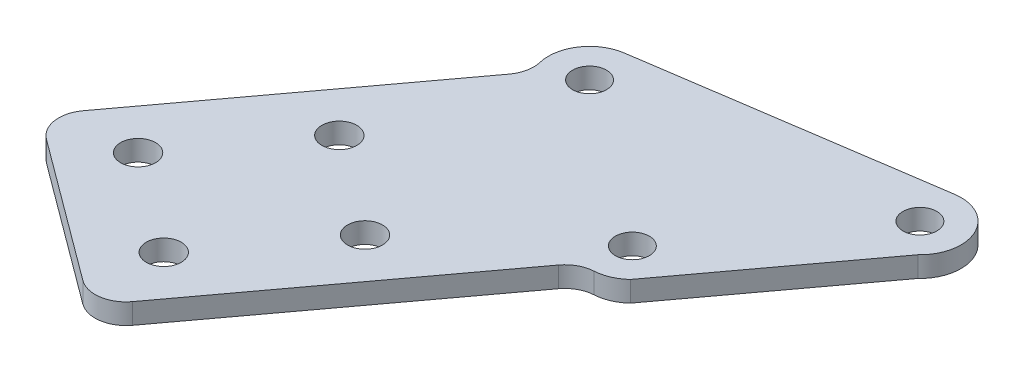
ISO-10303-21;
HEADER;
FILE_DESCRIPTION(('STEP AP214'),'2;1');
FILE_NAME('part.step','',(''),(''),'','','');
FILE_SCHEMA(('AUTOMOTIVE_DESIGN { 1 0 10303 214 1 1 1 1 }'));
ENDSEC;
DATA;
#1=APPLICATION_CONTEXT('core data for automotive mechanical design processes');
#2=APPLICATION_PROTOCOL_DEFINITION('international standard','automotive_design',2000,#1);
#3=PRODUCT_CONTEXT('',#1,'mechanical');
#4=PRODUCT('Part','Part','',(#3));
#5=PRODUCT_RELATED_PRODUCT_CATEGORY('part','',(#4));
#6=PRODUCT_DEFINITION_FORMATION('','',#4);
#7=PRODUCT_DEFINITION_CONTEXT('part definition',#1,'design');
#8=PRODUCT_DEFINITION('design','',#6,#7);
#9=PRODUCT_DEFINITION_SHAPE('','',#8);
#10=(LENGTH_UNIT() NAMED_UNIT(*) SI_UNIT(.MILLI.,.METRE.));
#11=(NAMED_UNIT(*) PLANE_ANGLE_UNIT() SI_UNIT($,.RADIAN.));
#12=(NAMED_UNIT(*) SI_UNIT($,.STERADIAN.) SOLID_ANGLE_UNIT());
#13=UNCERTAINTY_MEASURE_WITH_UNIT(LENGTH_MEASURE(1.E-05),#10,'distance_accuracy_value','');
#14=(GEOMETRIC_REPRESENTATION_CONTEXT(3) GLOBAL_UNCERTAINTY_ASSIGNED_CONTEXT((#13)) GLOBAL_UNIT_ASSIGNED_CONTEXT((#10,
#11,#12)) REPRESENTATION_CONTEXT('',''));
#15=CARTESIAN_POINT('',(0.,0.,0.));
#16=DIRECTION('',(0.,0.,1.));
#17=DIRECTION('',(1.,0.,0.));
#18=AXIS2_PLACEMENT_3D('',#15,#16,#17);
#19=CARTESIAN_POINT('',(-18.3951988573142,1.,118.677671571537));
#20=DIRECTION('',(0.,1.,0.));
#21=DIRECTION('',(0.,0.,1.));
#22=AXIS2_PLACEMENT_3D('',#19,#20,#21);
#23=PLANE('',#22);
#24=CARTESIAN_POINT('',(-6.26719335072895,1.,106.505511433226));
#25=DIRECTION('',(0.,1.,0.));
#26=DIRECTION('',(0.,0.,1.));
#27=AXIS2_PLACEMENT_3D('',#24,#25,#26);
#28=CIRCLE('',#27,1.7);
#29=CARTESIAN_POINT('',(-6.26719335072895,1.,108.205511433226));
#30=VERTEX_POINT('',#29);
#31=EDGE_CURVE('E336',#30,#30,#28,.T.);
#32=ORIENTED_EDGE('',*,*,#31,.F.);
#33=EDGE_LOOP('',(#32));
#34=FACE_BOUND('',#33,.T.);
#35=CARTESIAN_POINT('',(-14.6006047163785,1.,117.755144983296));
#36=DIRECTION('',(0.,1.,0.));
#37=DIRECTION('',(0.,0.,1.));
#38=AXIS2_PLACEMENT_3D('',#35,#36,#37);
#39=CIRCLE('',#38,1.7);
#40=CARTESIAN_POINT('',(-14.6006047163785,1.,119.455144983296));
#41=VERTEX_POINT('',#40);
#42=EDGE_CURVE('E345',#41,#41,#39,.T.);
#43=ORIENTED_EDGE('',*,*,#42,.F.);
#44=EDGE_LOOP('',(#43));
#45=FACE_BOUND('',#44,.T.);
#46=CARTESIAN_POINT('',(-4.95806167346095,1.,124.898069010996));
#47=DIRECTION('',(0.,1.,0.));
#48=DIRECTION('',(0.,0.,1.));
#49=AXIS2_PLACEMENT_3D('',#46,#47,#48);
#50=CIRCLE('',#49,1.7);
#51=CARTESIAN_POINT('',(-4.95806167346095,1.,126.598069010996));
#52=VERTEX_POINT('',#51);
#53=EDGE_CURVE('E355',#52,#52,#50,.T.);
#54=ORIENTED_EDGE('',*,*,#53,.F.);
#55=EDGE_LOOP('',(#54));
#56=FACE_BOUND('',#55,.T.);
#57=CARTESIAN_POINT('',(3.37534969218861,1.,113.648435460926));
#58=DIRECTION('',(0.,1.,0.));
#59=DIRECTION('',(0.,0.,1.));
#60=AXIS2_PLACEMENT_3D('',#57,#58,#59);
#61=CIRCLE('',#60,1.7);
#62=CARTESIAN_POINT('',(3.37534969218861,1.,115.348435460926));
#63=VERTEX_POINT('',#62);
#64=EDGE_CURVE('E363',#63,#63,#61,.T.);
#65=ORIENTED_EDGE('',*,*,#64,.F.);
#66=EDGE_LOOP('',(#65));
#67=FACE_BOUND('',#66,.T.);
#68=CARTESIAN_POINT('',(29.2087901697433,1.,85.4946905321915));
#69=DIRECTION('',(0.,1.,0.));
#70=DIRECTION('',(0.,0.,-1.));
#71=AXIS2_PLACEMENT_3D('',#68,#69,#70);
#72=CIRCLE('',#71,1.65000000727633);
#73=CARTESIAN_POINT('',(29.2087901697433,1.,83.8446905249152));
#74=VERTEX_POINT('',#73);
#75=EDGE_CURVE('E375',#74,#74,#72,.T.);
#76=ORIENTED_EDGE('',*,*,#75,.F.);
#77=EDGE_LOOP('',(#76));
#78=FACE_BOUND('',#77,.T.);
#79=CARTESIAN_POINT('',(-18.3951988573142,1.,118.677671571537));
#80=DIRECTION('',(0.,1.,0.));
#81=DIRECTION('',(0.,0.,1.));
#82=AXIS2_PLACEMENT_3D('',#79,#80,#81);
#83=CIRCLE('',#82,3.00000000000001);
#84=CARTESIAN_POINT('',(-20.8058346180431,1.,116.891940564611));
#85=VERTEX_POINT('',#84);
#86=CARTESIAN_POINT('',(-20.180929864239,1.,121.088307332266));
#87=VERTEX_POINT('',#86);
#88=EDGE_CURVE('E200',#85,#87,#83,.T.);
#89=ORIENTED_EDGE('',*,*,#88,.T.);
#90=DIRECTION('',(0.803545253576461,0.,0.595243668974934));
#91=VECTOR('',#90,1.);
#92=CARTESIAN_POINT('',(-6.52066055336954,1.,131.207449704892));
#93=LINE('',#92,#91);
#94=CARTESIAN_POINT('',(-6.52066055336952,1.,131.207449704892));
#95=VERTEX_POINT('',#94);
#96=EDGE_CURVE('E112',#87,#95,#93,.T.);
#97=ORIENTED_EDGE('',*,*,#96,.T.);
#98=CARTESIAN_POINT('',(-4.73492954644467,1.,128.796813944162));
#99=DIRECTION('',(0.,1.,0.));
#100=DIRECTION('',(0.,0.,-1.));
#101=AXIS2_PLACEMENT_3D('',#98,#99,#100);
#102=CIRCLE('',#101,3.00000000000002);
#103=CARTESIAN_POINT('',(-2.32429378571533,1.,130.582544951087));
#104=VERTEX_POINT('',#103);
#105=EDGE_CURVE('E237',#95,#104,#102,.T.);
#106=ORIENTED_EDGE('',*,*,#105,.T.);
#107=DIRECTION('',(0.595243668974969,0.,-0.803545253576435));
#108=VECTOR('',#107,1.);
#109=CARTESIAN_POINT('',(15.3175959976545,1.,106.766992533777));
#110=LINE('',#109,#108);
#111=CARTESIAN_POINT('',(15.3175959976545,1.,106.766992533777));
#112=VERTEX_POINT('',#111);
#113=EDGE_CURVE('E257',#104,#112,#110,.T.);
#114=ORIENTED_EDGE('',*,*,#113,.T.);
#115=CARTESIAN_POINT('',(17.7282317583839,1.,108.552723540702));
#116=DIRECTION('',(0.,-1.,0.));
#117=DIRECTION('',(0.,0.,1.));
#118=AXIS2_PLACEMENT_3D('',#115,#116,#117);
#119=CIRCLE('',#118,3.);
#120=CARTESIAN_POINT('',(17.5463824863155,1.,105.558240139135));
#121=VERTEX_POINT('',#120);
#122=EDGE_CURVE('E253',#112,#121,#119,.T.);
#123=ORIENTED_EDGE('',*,*,#122,.T.);
#124=CARTESIAN_POINT('',(17.3039167902256,1.,101.565595603714));
#125=DIRECTION('',(0.,1.,0.));
#126=DIRECTION('',(0.,0.,-1.));
#127=AXIS2_PLACEMENT_3D('',#124,#125,#126);
#128=CIRCLE('',#127,4.00000000000122);
#129=CARTESIAN_POINT('',(20.028844772003,1.,104.493865996647));
#130=VERTEX_POINT('',#129);
#131=EDGE_CURVE('E256',#121,#130,#128,.T.);
#132=ORIENTED_EDGE('',*,*,#131,.T.);
#133=DIRECTION('',(0.595243668975705,0.,-0.80354525357589));
#134=VECTOR('',#133,1.);
#135=CARTESIAN_POINT('',(20.028844772003,1.,104.493865996647));
#136=LINE('',#135,#134);
#137=CARTESIAN_POINT('',(31.9337181515207,1.,88.4229609251242));
#138=VERTEX_POINT('',#137);
#139=EDGE_CURVE('E261',#130,#138,#136,.T.);
#140=ORIENTED_EDGE('',*,*,#139,.T.);
#141=CARTESIAN_POINT('',(29.2087901697433,1.,85.4946905321915));
#142=DIRECTION('',(0.,1.,0.));
#143=DIRECTION('',(0.,0.,-1.));
#144=AXIS2_PLACEMENT_3D('',#141,#142,#143);
#145=CIRCLE('',#144,4.);
#146=CARTESIAN_POINT('',(28.6196243177309,1.,81.5383180018523));
#147=VERTEX_POINT('',#146);
#148=EDGE_CURVE('E268',#138,#147,#145,.T.);
#149=ORIENTED_EDGE('',*,*,#148,.T.);
#150=DIRECTION('',(-0.989093132584809,0.,0.14729146300302));
#151=VECTOR('',#150,1.);
#152=CARTESIAN_POINT('',(28.6196243177309,1.,81.5383180018523));
#153=LINE('',#152,#151);
#154=CARTESIAN_POINT('',(0.643845866701124,1.,85.7043496938651));
#155=VERTEX_POINT('',#154);
#156=EDGE_CURVE('E143',#147,#155,#153,.T.);
#157=ORIENTED_EDGE('',*,*,#156,.T.);
#158=CARTESIAN_POINT('',(1.23301171871352,1.,89.6607222242043));
#159=DIRECTION('',(0.,1.,0.));
#160=DIRECTION('',(0.,0.,-1.));
#161=AXIS2_PLACEMENT_3D('',#158,#159,#160);
#162=CIRCLE('',#161,4.00000000000001);
#163=CARTESIAN_POINT('',(-2.65704100219803,1.,90.5921135643663));
#164=VERTEX_POINT('',#163);
#165=EDGE_CURVE('E137',#155,#164,#162,.T.);
#166=ORIENTED_EDGE('',*,*,#165,.T.);
#167=CARTESIAN_POINT('',(-5.57458054288167,1.,91.2906570694878));
#168=DIRECTION('',(0.,-1.,0.));
#169=DIRECTION('',(0.,0.,1.));
#170=AXIS2_PLACEMENT_3D('',#167,#168,#169);
#171=CIRCLE('',#170,2.99999999999999);
#172=CARTESIAN_POINT('',(-3.1639447821528,1.,93.0763880764132));
#173=VERTEX_POINT('',#172);
#174=EDGE_CURVE('E141',#164,#173,#171,.T.);
#175=ORIENTED_EDGE('',*,*,#174,.T.);
#176=DIRECTION('',(-0.595243668975159,0.,0.803545253576294));
#177=VECTOR('',#176,1.);
#178=CARTESIAN_POINT('',(-3.1639447821528,1.,93.0763880764132));
#179=LINE('',#178,#177);
#180=EDGE_CURVE('E57',#173,#85,#179,.T.);
#181=ORIENTED_EDGE('',*,*,#180,.T.);
#182=EDGE_LOOP('',(#89,#97,#106,#114,#123,#132,#140,#149,#157,#166,#175,#181));
#183=FACE_BOUND('',#182,.T.);
#184=CARTESIAN_POINT('',(1.23301171871352,1.,89.6607222242043));
#185=DIRECTION('',(0.,1.,0.));
#186=DIRECTION('',(0.,0.,-1.));
#187=AXIS2_PLACEMENT_3D('',#184,#185,#186);
#188=CIRCLE('',#187,1.65000000726581);
#189=CARTESIAN_POINT('',(1.23301171871352,1.,88.0107222169385));
#190=VERTEX_POINT('',#189);
#191=EDGE_CURVE('E170',#190,#190,#188,.T.);
#192=ORIENTED_EDGE('',*,*,#191,.F.);
#193=EDGE_LOOP('',(#192));
#194=FACE_BOUND('',#193,.T.);
#195=CARTESIAN_POINT('',(17.3039167902256,1.,101.565595603714));
#196=DIRECTION('',(0.,1.,0.));
#197=DIRECTION('',(0.,0.,-1.));
#198=AXIS2_PLACEMENT_3D('',#195,#196,#197);
#199=CIRCLE('',#198,1.65000000725752);
#200=CARTESIAN_POINT('',(17.3039167902256,1.,99.9155955964567));
#201=VERTEX_POINT('',#200);
#202=EDGE_CURVE('E367',#201,#201,#199,.T.);
#203=ORIENTED_EDGE('',*,*,#202,.F.);
#204=EDGE_LOOP('',(#203));
#205=FACE_BOUND('',#204,.T.);
#206=ADVANCED_FACE('F39',(#34,#45,#56,#67,#78,#183,#194,#205),#23,.T.);
#207=CARTESIAN_POINT('',(-18.3951988573142,-1.,118.677671571537));
#208=DIRECTION('',(0.,1.,0.));
#209=DIRECTION('',(0.,0.,1.));
#210=AXIS2_PLACEMENT_3D('',#207,#208,#209);
#211=PLANE('',#210);
#212=CARTESIAN_POINT('',(-6.26719335072895,-1.,106.505511433226));
#213=DIRECTION('',(0.,1.,0.));
#214=DIRECTION('',(0.,0.,1.));
#215=AXIS2_PLACEMENT_3D('',#212,#213,#214);
#216=CIRCLE('',#215,1.7);
#217=CARTESIAN_POINT('',(-6.26719335072895,-1.,108.205511433226));
#218=VERTEX_POINT('',#217);
#219=EDGE_CURVE('E334',#218,#218,#216,.T.);
#220=ORIENTED_EDGE('',*,*,#219,.T.);
#221=EDGE_LOOP('',(#220));
#222=FACE_BOUND('',#221,.T.);
#223=CARTESIAN_POINT('',(-14.6006047163785,-1.,117.755144983296));
#224=DIRECTION('',(0.,1.,0.));
#225=DIRECTION('',(0.,0.,1.));
#226=AXIS2_PLACEMENT_3D('',#223,#224,#225);
#227=CIRCLE('',#226,1.7);
#228=CARTESIAN_POINT('',(-14.6006047163785,-1.,119.455144983296));
#229=VERTEX_POINT('',#228);
#230=EDGE_CURVE('E338',#229,#229,#227,.T.);
#231=ORIENTED_EDGE('',*,*,#230,.T.);
#232=EDGE_LOOP('',(#231));
#233=FACE_BOUND('',#232,.T.);
#234=CARTESIAN_POINT('',(-4.95806167346095,-1.,124.898069010996));
#235=DIRECTION('',(0.,1.,0.));
#236=DIRECTION('',(0.,0.,1.));
#237=AXIS2_PLACEMENT_3D('',#234,#235,#236);
#238=CIRCLE('',#237,1.7);
#239=CARTESIAN_POINT('',(-4.95806167346095,-1.,126.598069010996));
#240=VERTEX_POINT('',#239);
#241=EDGE_CURVE('E351',#240,#240,#238,.T.);
#242=ORIENTED_EDGE('',*,*,#241,.T.);
#243=EDGE_LOOP('',(#242));
#244=FACE_BOUND('',#243,.T.);
#245=CARTESIAN_POINT('',(3.37534969218861,-1.,113.648435460926));
#246=DIRECTION('',(0.,1.,0.));
#247=DIRECTION('',(0.,0.,1.));
#248=AXIS2_PLACEMENT_3D('',#245,#246,#247);
#249=CIRCLE('',#248,1.7);
#250=CARTESIAN_POINT('',(3.37534969218861,-1.,115.348435460926));
#251=VERTEX_POINT('',#250);
#252=EDGE_CURVE('E359',#251,#251,#249,.T.);
#253=ORIENTED_EDGE('',*,*,#252,.T.);
#254=EDGE_LOOP('',(#253));
#255=FACE_BOUND('',#254,.T.);
#256=CARTESIAN_POINT('',(-18.3951988573142,-1.,118.677671571537));
#257=DIRECTION('',(0.,1.,0.));
#258=DIRECTION('',(0.,0.,1.));
#259=AXIS2_PLACEMENT_3D('',#256,#257,#258);
#260=CIRCLE('',#259,3.00000000000001);
#261=CARTESIAN_POINT('',(-20.8058346180431,-1.,116.891940564611));
#262=VERTEX_POINT('',#261);
#263=CARTESIAN_POINT('',(-20.180929864239,-1.,121.088307332266));
#264=VERTEX_POINT('',#263);
#265=EDGE_CURVE('E165',#262,#264,#260,.T.);
#266=ORIENTED_EDGE('',*,*,#265,.F.);
#267=DIRECTION('',(-0.595243668975159,0.,0.803545253576294));
#268=VECTOR('',#267,1.);
#269=CARTESIAN_POINT('',(-3.1639447821528,-1.,93.0763880764132));
#270=LINE('',#269,#268);
#271=CARTESIAN_POINT('',(-3.1639447821528,-1.,93.0763880764132));
#272=VERTEX_POINT('',#271);
#273=EDGE_CURVE('E104',#272,#262,#270,.T.);
#274=ORIENTED_EDGE('',*,*,#273,.F.);
#275=CARTESIAN_POINT('',(-5.57458054288167,-1.,91.2906570694878));
#276=DIRECTION('',(0.,-1.,0.));
#277=DIRECTION('',(0.,0.,1.));
#278=AXIS2_PLACEMENT_3D('',#275,#276,#277);
#279=CIRCLE('',#278,2.99999999999999);
#280=CARTESIAN_POINT('',(-2.65704100219803,-1.,90.5921135643663));
#281=VERTEX_POINT('',#280);
#282=EDGE_CURVE('E98',#281,#272,#279,.T.);
#283=ORIENTED_EDGE('',*,*,#282,.F.);
#284=CARTESIAN_POINT('',(1.23301171871352,-1.,89.6607222242043));
#285=DIRECTION('',(0.,1.,0.));
#286=DIRECTION('',(0.,0.,-1.));
#287=AXIS2_PLACEMENT_3D('',#284,#285,#286);
#288=CIRCLE('',#287,4.00000000000001);
#289=CARTESIAN_POINT('',(0.643845866701124,-1.,85.7043496938651));
#290=VERTEX_POINT('',#289);
#291=EDGE_CURVE('E152',#290,#281,#288,.T.);
#292=ORIENTED_EDGE('',*,*,#291,.F.);
#293=DIRECTION('',(-0.989093132584809,0.,0.14729146300302));
#294=VECTOR('',#293,1.);
#295=CARTESIAN_POINT('',(28.6196243177309,-1.,81.5383180018523));
#296=LINE('',#295,#294);
#297=CARTESIAN_POINT('',(28.6196243177309,-1.,81.5383180018523));
#298=VERTEX_POINT('',#297);
#299=EDGE_CURVE('E191',#298,#290,#296,.T.);
#300=ORIENTED_EDGE('',*,*,#299,.F.);
#301=CARTESIAN_POINT('',(29.2087901697433,-1.,85.4946905321915));
#302=DIRECTION('',(0.,1.,0.));
#303=DIRECTION('',(0.,0.,-1.));
#304=AXIS2_PLACEMENT_3D('',#301,#302,#303);
#305=CIRCLE('',#304,4.);
#306=CARTESIAN_POINT('',(31.9337181515207,-1.,88.4229609251242));
#307=VERTEX_POINT('',#306);
#308=EDGE_CURVE('E188',#307,#298,#305,.T.);
#309=ORIENTED_EDGE('',*,*,#308,.F.);
#310=DIRECTION('',(0.595243668975705,0.,-0.80354525357589));
#311=VECTOR('',#310,1.);
#312=CARTESIAN_POINT('',(20.028844772003,-1.,104.493865996647));
#313=LINE('',#312,#311);
#314=CARTESIAN_POINT('',(20.028844772003,-1.,104.493865996647));
#315=VERTEX_POINT('',#314);
#316=EDGE_CURVE('E185',#315,#307,#313,.T.);
#317=ORIENTED_EDGE('',*,*,#316,.F.);
#318=CARTESIAN_POINT('',(17.3039167902256,-1.,101.565595603714));
#319=DIRECTION('',(0.,1.,0.));
#320=DIRECTION('',(0.,0.,-1.));
#321=AXIS2_PLACEMENT_3D('',#318,#319,#320);
#322=CIRCLE('',#321,4.00000000000122);
#323=CARTESIAN_POINT('',(17.5463824863155,-1.,105.558240139135));
#324=VERTEX_POINT('',#323);
#325=EDGE_CURVE('E182',#324,#315,#322,.T.);
#326=ORIENTED_EDGE('',*,*,#325,.F.);
#327=CARTESIAN_POINT('',(17.7282317583839,-1.,108.552723540702));
#328=DIRECTION('',(0.,-1.,0.));
#329=DIRECTION('',(0.,0.,1.));
#330=AXIS2_PLACEMENT_3D('',#327,#328,#329);
#331=CIRCLE('',#330,3.);
#332=CARTESIAN_POINT('',(15.3175959976545,-1.,106.766992533777));
#333=VERTEX_POINT('',#332);
#334=EDGE_CURVE('E179',#333,#324,#331,.T.);
#335=ORIENTED_EDGE('',*,*,#334,.F.);
#336=DIRECTION('',(0.595243668974969,0.,-0.803545253576435));
#337=VECTOR('',#336,1.);
#338=CARTESIAN_POINT('',(15.3175959976545,-1.,106.766992533777));
#339=LINE('',#338,#337);
#340=CARTESIAN_POINT('',(-2.32429378571533,-1.,130.582544951087));
#341=VERTEX_POINT('',#340);
#342=EDGE_CURVE('E176',#341,#333,#339,.T.);
#343=ORIENTED_EDGE('',*,*,#342,.F.);
#344=CARTESIAN_POINT('',(-4.73492954644467,-1.,128.796813944162));
#345=DIRECTION('',(0.,1.,0.));
#346=DIRECTION('',(0.,0.,-1.));
#347=AXIS2_PLACEMENT_3D('',#344,#345,#346);
#348=CIRCLE('',#347,3.00000000000002);
#349=CARTESIAN_POINT('',(-6.52066055336952,-1.,131.207449704892));
#350=VERTEX_POINT('',#349);
#351=EDGE_CURVE('E173',#350,#341,#348,.T.);
#352=ORIENTED_EDGE('',*,*,#351,.F.);
#353=DIRECTION('',(0.803545253576461,0.,0.595243668974934));
#354=VECTOR('',#353,1.);
#355=CARTESIAN_POINT('',(-6.52066055336954,-1.,131.207449704892));
#356=LINE('',#355,#354);
#357=EDGE_CURVE('E169',#264,#350,#356,.T.);
#358=ORIENTED_EDGE('',*,*,#357,.F.);
#359=EDGE_LOOP('',(#266,#274,#283,#292,#300,#309,#317,#326,#335,#343,#352,#358));
#360=FACE_BOUND('',#359,.T.);
#361=CARTESIAN_POINT('',(1.23301171871352,-1.,89.6607222242043));
#362=DIRECTION('',(0.,1.,0.));
#363=DIRECTION('',(0.,0.,-1.));
#364=AXIS2_PLACEMENT_3D('',#361,#362,#363);
#365=CIRCLE('',#364,1.65000000726581);
#366=CARTESIAN_POINT('',(1.23301171871352,-1.,88.0107222169385));
#367=VERTEX_POINT('',#366);
#368=EDGE_CURVE('E379',#367,#367,#365,.T.);
#369=ORIENTED_EDGE('',*,*,#368,.T.);
#370=EDGE_LOOP('',(#369));
#371=FACE_BOUND('',#370,.T.);
#372=CARTESIAN_POINT('',(29.2087901697433,-1.,85.4946905321915));
#373=DIRECTION('',(0.,1.,0.));
#374=DIRECTION('',(0.,0.,-1.));
#375=AXIS2_PLACEMENT_3D('',#372,#373,#374);
#376=CIRCLE('',#375,1.65000000727633);
#377=CARTESIAN_POINT('',(29.2087901697433,-1.,83.8446905249152));
#378=VERTEX_POINT('',#377);
#379=EDGE_CURVE('E371',#378,#378,#376,.T.);
#380=ORIENTED_EDGE('',*,*,#379,.T.);
#381=EDGE_LOOP('',(#380));
#382=FACE_BOUND('',#381,.T.);
#383=CARTESIAN_POINT('',(17.3039167902256,-1.,101.565595603714));
#384=DIRECTION('',(0.,1.,0.));
#385=DIRECTION('',(0.,0.,-1.));
#386=AXIS2_PLACEMENT_3D('',#383,#384,#385);
#387=CIRCLE('',#386,1.65000000725752);
#388=CARTESIAN_POINT('',(17.3039167902256,-1.,99.9155955964567));
#389=VERTEX_POINT('',#388);
#390=EDGE_CURVE('E342',#389,#389,#387,.T.);
#391=ORIENTED_EDGE('',*,*,#390,.T.);
#392=EDGE_LOOP('',(#391));
#393=FACE_BOUND('',#392,.T.);
#394=ADVANCED_FACE('F241',(#222,#233,#244,#255,#360,#371,#382,#393),#211,.F.);
#395=CARTESIAN_POINT('',(-18.3951988573142,1.,118.677671571537));
#396=DIRECTION('',(0.,-1.,0.));
#397=DIRECTION('',(0.,0.,-1.));
#398=AXIS2_PLACEMENT_3D('',#395,#396,#397);
#399=CYLINDRICAL_SURFACE('',#398,3.00000000000001);
#400=ORIENTED_EDGE('',*,*,#265,.T.);
#401=DIRECTION('',(0.,-1.,0.));
#402=VECTOR('',#401,1.);
#403=CARTESIAN_POINT('',(-20.180929864239,1.,121.088307332266));
#404=LINE('',#403,#402);
#405=EDGE_CURVE('E11',#87,#264,#404,.T.);
#406=ORIENTED_EDGE('',*,*,#405,.F.);
#407=ORIENTED_EDGE('',*,*,#88,.F.);
#408=DIRECTION('',(0.,-1.,0.));
#409=VECTOR('',#408,1.);
#410=CARTESIAN_POINT('',(-20.8058346180431,1.,116.891940564611));
#411=LINE('',#410,#409);
#412=EDGE_CURVE('E161',#85,#262,#411,.T.);
#413=ORIENTED_EDGE('',*,*,#412,.T.);
#414=EDGE_LOOP('',(#400,#406,#407,#413));
#415=FACE_BOUND('',#414,.T.);
#416=ADVANCED_FACE('F41',(#415),#399,.T.);
#417=CARTESIAN_POINT('',(-6.52066055336954,1.,131.207449704892));
#418=DIRECTION('',(0.595243668974934,0.,-0.803545253576461));
#419=DIRECTION('',(-0.803545253576461,0.,-0.595243668974934));
#420=AXIS2_PLACEMENT_3D('',#417,#418,#419);
#421=PLANE('',#420);
#422=ORIENTED_EDGE('',*,*,#357,.T.);
#423=DIRECTION('',(0.,-1.,0.));
#424=VECTOR('',#423,1.);
#425=CARTESIAN_POINT('',(-6.52066055336952,1.,131.207449704892));
#426=LINE('',#425,#424);
#427=EDGE_CURVE('E49',#95,#350,#426,.T.);
#428=ORIENTED_EDGE('',*,*,#427,.F.);
#429=ORIENTED_EDGE('',*,*,#96,.F.);
#430=ORIENTED_EDGE('',*,*,#405,.T.);
#431=EDGE_LOOP('',(#422,#428,#429,#430));
#432=FACE_BOUND('',#431,.T.);
#433=ADVANCED_FACE('F524',(#432),#421,.F.);
#434=CARTESIAN_POINT('',(-4.73492954644467,1.,128.796813944162));
#435=DIRECTION('',(0.,-1.,0.));
#436=DIRECTION('',(0.,0.,-1.));
#437=AXIS2_PLACEMENT_3D('',#434,#435,#436);
#438=CYLINDRICAL_SURFACE('',#437,3.00000000000002);
#439=ORIENTED_EDGE('',*,*,#351,.T.);
#440=DIRECTION('',(0.,-1.,0.));
#441=VECTOR('',#440,1.);
#442=CARTESIAN_POINT('',(-2.32429378571533,1.,130.582544951087));
#443=LINE('',#442,#441);
#444=EDGE_CURVE('E227',#104,#341,#443,.T.);
#445=ORIENTED_EDGE('',*,*,#444,.F.);
#446=ORIENTED_EDGE('',*,*,#105,.F.);
#447=ORIENTED_EDGE('',*,*,#427,.T.);
#448=EDGE_LOOP('',(#439,#445,#446,#447));
#449=FACE_BOUND('',#448,.T.);
#450=ADVANCED_FACE('F235',(#449),#438,.T.);
#451=CARTESIAN_POINT('',(15.3175959976545,1.,106.766992533777));
#452=DIRECTION('',(-0.803545253576435,0.,-0.595243668974969));
#453=DIRECTION('',(-0.595243668974969,0.,0.803545253576435));
#454=AXIS2_PLACEMENT_3D('',#451,#452,#453);
#455=PLANE('',#454);
#456=ORIENTED_EDGE('',*,*,#342,.T.);
#457=DIRECTION('',(0.,-1.,0.));
#458=VECTOR('',#457,1.);
#459=CARTESIAN_POINT('',(15.3175959976545,1.,106.766992533777));
#460=LINE('',#459,#458);
#461=EDGE_CURVE('E223',#112,#333,#460,.T.);
#462=ORIENTED_EDGE('',*,*,#461,.F.);
#463=ORIENTED_EDGE('',*,*,#113,.F.);
#464=ORIENTED_EDGE('',*,*,#444,.T.);
#465=EDGE_LOOP('',(#456,#462,#463,#464));
#466=FACE_BOUND('',#465,.T.);
#467=ADVANCED_FACE('F247',(#466),#455,.F.);
#468=CARTESIAN_POINT('',(17.7282317583839,1.,108.552723540702));
#469=DIRECTION('',(0.,-1.,0.));
#470=DIRECTION('',(0.,0.,-1.));
#471=AXIS2_PLACEMENT_3D('',#468,#469,#470);
#472=CYLINDRICAL_SURFACE('',#471,3.);
#473=ORIENTED_EDGE('',*,*,#334,.T.);
#474=DIRECTION('',(0.,-1.,0.));
#475=VECTOR('',#474,1.);
#476=CARTESIAN_POINT('',(17.5463824863155,1.,105.558240139135));
#477=LINE('',#476,#475);
#478=EDGE_CURVE('E219',#121,#324,#477,.T.);
#479=ORIENTED_EDGE('',*,*,#478,.F.);
#480=ORIENTED_EDGE('',*,*,#122,.F.);
#481=ORIENTED_EDGE('',*,*,#461,.T.);
#482=EDGE_LOOP('',(#473,#479,#480,#481));
#483=FACE_BOUND('',#482,.T.);
#484=ADVANCED_FACE('F251',(#483),#472,.F.);
#485=CARTESIAN_POINT('',(17.3039167902256,1.,101.565595603714));
#486=DIRECTION('',(0.,-1.,0.));
#487=DIRECTION('',(0.,0.,-1.));
#488=AXIS2_PLACEMENT_3D('',#485,#486,#487);
#489=CYLINDRICAL_SURFACE('',#488,4.00000000000122);
#490=ORIENTED_EDGE('',*,*,#325,.T.);
#491=DIRECTION('',(0.,-1.,0.));
#492=VECTOR('',#491,1.);
#493=CARTESIAN_POINT('',(20.028844772003,1.,104.493865996647));
#494=LINE('',#493,#492);
#495=EDGE_CURVE('E215',#130,#315,#494,.T.);
#496=ORIENTED_EDGE('',*,*,#495,.F.);
#497=ORIENTED_EDGE('',*,*,#131,.F.);
#498=ORIENTED_EDGE('',*,*,#478,.T.);
#499=EDGE_LOOP('',(#490,#496,#497,#498));
#500=FACE_BOUND('',#499,.T.);
#501=ADVANCED_FACE('F489',(#500),#489,.T.);
#502=CARTESIAN_POINT('',(20.028844772003,1.,104.493865996647));
#503=DIRECTION('',(-0.80354525357589,0.,-0.595243668975705));
#504=DIRECTION('',(-0.595243668975705,0.,0.80354525357589));
#505=AXIS2_PLACEMENT_3D('',#502,#503,#504);
#506=PLANE('',#505);
#507=ORIENTED_EDGE('',*,*,#316,.T.);
#508=DIRECTION('',(0.,-1.,0.));
#509=VECTOR('',#508,1.);
#510=CARTESIAN_POINT('',(31.9337181515207,1.,88.4229609251242));
#511=LINE('',#510,#509);
#512=EDGE_CURVE('E211',#138,#307,#511,.T.);
#513=ORIENTED_EDGE('',*,*,#512,.F.);
#514=ORIENTED_EDGE('',*,*,#139,.F.);
#515=ORIENTED_EDGE('',*,*,#495,.T.);
#516=EDGE_LOOP('',(#507,#513,#514,#515));
#517=FACE_BOUND('',#516,.T.);
#518=ADVANCED_FACE('F480',(#517),#506,.F.);
#519=CARTESIAN_POINT('',(29.2087901697433,1.,85.4946905321915));
#520=DIRECTION('',(0.,-1.,0.));
#521=DIRECTION('',(0.,0.,-1.));
#522=AXIS2_PLACEMENT_3D('',#519,#520,#521);
#523=CYLINDRICAL_SURFACE('',#522,4.);
#524=ORIENTED_EDGE('',*,*,#308,.T.);
#525=DIRECTION('',(0.,-1.,0.));
#526=VECTOR('',#525,1.);
#527=CARTESIAN_POINT('',(28.6196243177309,1.,81.5383180018523));
#528=LINE('',#527,#526);
#529=EDGE_CURVE('E207',#147,#298,#528,.T.);
#530=ORIENTED_EDGE('',*,*,#529,.F.);
#531=ORIENTED_EDGE('',*,*,#148,.F.);
#532=ORIENTED_EDGE('',*,*,#512,.T.);
#533=EDGE_LOOP('',(#524,#530,#531,#532));
#534=FACE_BOUND('',#533,.T.);
#535=ADVANCED_FACE('F276',(#534),#523,.T.);
#536=CARTESIAN_POINT('',(28.6196243177309,1.,81.5383180018523));
#537=DIRECTION('',(0.14729146300302,0.,0.989093132584809));
#538=DIRECTION('',(0.989093132584809,0.,-0.14729146300302));
#539=AXIS2_PLACEMENT_3D('',#536,#537,#538);
#540=PLANE('',#539);
#541=ORIENTED_EDGE('',*,*,#299,.T.);
#542=DIRECTION('',(0.,-1.,0.));
#543=VECTOR('',#542,1.);
#544=CARTESIAN_POINT('',(0.643845866701124,1.,85.7043496938651));
#545=LINE('',#544,#543);
#546=EDGE_CURVE('E154',#155,#290,#545,.T.);
#547=ORIENTED_EDGE('',*,*,#546,.F.);
#548=ORIENTED_EDGE('',*,*,#156,.F.);
#549=ORIENTED_EDGE('',*,*,#529,.T.);
#550=EDGE_LOOP('',(#541,#547,#548,#549));
#551=FACE_BOUND('',#550,.T.);
#552=ADVANCED_FACE('F280',(#551),#540,.F.);
#553=CARTESIAN_POINT('',(1.23301171871352,1.,89.6607222242043));
#554=DIRECTION('',(0.,-1.,0.));
#555=DIRECTION('',(0.,0.,-1.));
#556=AXIS2_PLACEMENT_3D('',#553,#554,#555);
#557=CYLINDRICAL_SURFACE('',#556,4.00000000000001);
#558=ORIENTED_EDGE('',*,*,#291,.T.);
#559=DIRECTION('',(0.,-1.,0.));
#560=VECTOR('',#559,1.);
#561=CARTESIAN_POINT('',(-2.65704100219803,1.,90.5921135643663));
#562=LINE('',#561,#560);
#563=EDGE_CURVE('E149',#164,#281,#562,.T.);
#564=ORIENTED_EDGE('',*,*,#563,.F.);
#565=ORIENTED_EDGE('',*,*,#165,.F.);
#566=ORIENTED_EDGE('',*,*,#546,.T.);
#567=EDGE_LOOP('',(#558,#564,#565,#566));
#568=FACE_BOUND('',#567,.T.);
#569=ADVANCED_FACE('F150',(#568),#557,.T.);
#570=CARTESIAN_POINT('',(-5.57458054288167,1.,91.2906570694878));
#571=DIRECTION('',(0.,-1.,0.));
#572=DIRECTION('',(0.,0.,-1.));
#573=AXIS2_PLACEMENT_3D('',#570,#571,#572);
#574=CYLINDRICAL_SURFACE('',#573,2.99999999999999);
#575=ORIENTED_EDGE('',*,*,#282,.T.);
#576=DIRECTION('',(0.,-1.,0.));
#577=VECTOR('',#576,1.);
#578=CARTESIAN_POINT('',(-3.1639447821528,1.,93.0763880764132));
#579=LINE('',#578,#577);
#580=EDGE_CURVE('E155',#173,#272,#579,.T.);
#581=ORIENTED_EDGE('',*,*,#580,.F.);
#582=ORIENTED_EDGE('',*,*,#174,.F.);
#583=ORIENTED_EDGE('',*,*,#563,.T.);
#584=EDGE_LOOP('',(#575,#581,#582,#583));
#585=FACE_BOUND('',#584,.T.);
#586=ADVANCED_FACE('F157',(#585),#574,.F.);
#587=CARTESIAN_POINT('',(-3.1639447821528,1.,93.0763880764132));
#588=DIRECTION('',(0.803545253576295,0.,0.595243668975159));
#589=DIRECTION('',(0.595243668975159,0.,-0.803545253576295));
#590=AXIS2_PLACEMENT_3D('',#587,#588,#589);
#591=PLANE('',#590);
#592=ORIENTED_EDGE('',*,*,#273,.T.);
#593=ORIENTED_EDGE('',*,*,#412,.F.);
#594=ORIENTED_EDGE('',*,*,#180,.F.);
#595=ORIENTED_EDGE('',*,*,#580,.T.);
#596=EDGE_LOOP('',(#592,#593,#594,#595));
#597=FACE_BOUND('',#596,.T.);
#598=ADVANCED_FACE('F284',(#597),#591,.F.);
#599=CARTESIAN_POINT('',(1.23301171871352,1.,89.6607222242043));
#600=DIRECTION('',(0.,-1.,0.));
#601=DIRECTION('',(0.,0.,-1.));
#602=AXIS2_PLACEMENT_3D('',#599,#600,#601);
#603=CYLINDRICAL_SURFACE('',#602,1.65000000726581);
#604=ORIENTED_EDGE('',*,*,#191,.T.);
#605=EDGE_LOOP('',(#604));
#606=FACE_BOUND('',#605,.T.);
#607=ORIENTED_EDGE('',*,*,#368,.F.);
#608=EDGE_LOOP('',(#607));
#609=FACE_BOUND('',#608,.T.);
#610=ADVANCED_FACE('F286',(#606,#609),#603,.F.);
#611=CARTESIAN_POINT('',(29.2087901697433,1.,85.4946905321915));
#612=DIRECTION('',(0.,-1.,0.));
#613=DIRECTION('',(0.,0.,-1.));
#614=AXIS2_PLACEMENT_3D('',#611,#612,#613);
#615=CYLINDRICAL_SURFACE('',#614,1.65000000727633);
#616=ORIENTED_EDGE('',*,*,#75,.T.);
#617=EDGE_LOOP('',(#616));
#618=FACE_BOUND('',#617,.T.);
#619=ORIENTED_EDGE('',*,*,#379,.F.);
#620=EDGE_LOOP('',(#619));
#621=FACE_BOUND('',#620,.T.);
#622=ADVANCED_FACE('F292',(#618,#621),#615,.F.);
#623=CARTESIAN_POINT('',(17.3039167902256,1.,101.565595603714));
#624=DIRECTION('',(0.,-1.,0.));
#625=DIRECTION('',(0.,0.,-1.));
#626=AXIS2_PLACEMENT_3D('',#623,#624,#625);
#627=CYLINDRICAL_SURFACE('',#626,1.65000000725752);
#628=ORIENTED_EDGE('',*,*,#202,.T.);
#629=EDGE_LOOP('',(#628));
#630=FACE_BOUND('',#629,.T.);
#631=ORIENTED_EDGE('',*,*,#390,.F.);
#632=EDGE_LOOP('',(#631));
#633=FACE_BOUND('',#632,.T.);
#634=ADVANCED_FACE('F309',(#630,#633),#627,.F.);
#635=CARTESIAN_POINT('',(3.37534969218861,-1.,113.648435460926));
#636=DIRECTION('',(0.,1.,0.));
#637=DIRECTION('',(0.,0.,1.));
#638=AXIS2_PLACEMENT_3D('',#635,#636,#637);
#639=CYLINDRICAL_SURFACE('',#638,1.7);
#640=ORIENTED_EDGE('',*,*,#252,.F.);
#641=EDGE_LOOP('',(#640));
#642=FACE_BOUND('',#641,.T.);
#643=ORIENTED_EDGE('',*,*,#64,.T.);
#644=EDGE_LOOP('',(#643));
#645=FACE_BOUND('',#644,.T.);
#646=ADVANCED_FACE('F313',(#642,#645),#639,.F.);
#647=CARTESIAN_POINT('',(-4.95806167346095,-1.,124.898069010996));
#648=DIRECTION('',(0.,1.,0.));
#649=DIRECTION('',(0.,0.,1.));
#650=AXIS2_PLACEMENT_3D('',#647,#648,#649);
#651=CYLINDRICAL_SURFACE('',#650,1.7);
#652=ORIENTED_EDGE('',*,*,#241,.F.);
#653=EDGE_LOOP('',(#652));
#654=FACE_BOUND('',#653,.T.);
#655=ORIENTED_EDGE('',*,*,#53,.T.);
#656=EDGE_LOOP('',(#655));
#657=FACE_BOUND('',#656,.T.);
#658=ADVANCED_FACE('F317',(#654,#657),#651,.F.);
#659=CARTESIAN_POINT('',(-14.6006047163785,-1.,117.755144983296));
#660=DIRECTION('',(0.,1.,0.));
#661=DIRECTION('',(0.,0.,1.));
#662=AXIS2_PLACEMENT_3D('',#659,#660,#661);
#663=CYLINDRICAL_SURFACE('',#662,1.7);
#664=ORIENTED_EDGE('',*,*,#230,.F.);
#665=EDGE_LOOP('',(#664));
#666=FACE_BOUND('',#665,.T.);
#667=ORIENTED_EDGE('',*,*,#42,.T.);
#668=EDGE_LOOP('',(#667));
#669=FACE_BOUND('',#668,.T.);
#670=ADVANCED_FACE('F321',(#666,#669),#663,.F.);
#671=CARTESIAN_POINT('',(-6.26719335072895,-1.,106.505511433226));
#672=DIRECTION('',(0.,1.,0.));
#673=DIRECTION('',(0.,0.,1.));
#674=AXIS2_PLACEMENT_3D('',#671,#672,#673);
#675=CYLINDRICAL_SURFACE('',#674,1.7);
#676=ORIENTED_EDGE('',*,*,#219,.F.);
#677=EDGE_LOOP('',(#676));
#678=FACE_BOUND('',#677,.T.);
#679=ORIENTED_EDGE('',*,*,#31,.T.);
#680=EDGE_LOOP('',(#679));
#681=FACE_BOUND('',#680,.T.);
#682=ADVANCED_FACE('F325',(#678,#681),#675,.F.);
#683=CLOSED_SHELL('',(#206,#394,#416,#433,#450,#467,#484,#501,#518,#535,#552,#569,#586,#598,
#610,#622,#634,#646,#658,#670,#682));
#684=MANIFOLD_SOLID_BREP('B2',#683);
#685=ADVANCED_BREP_SHAPE_REPRESENTATION('',(#18,#684),#14);
#686=SHAPE_DEFINITION_REPRESENTATION(#9,#685);
ENDSEC;
END-ISO-10303-21;
